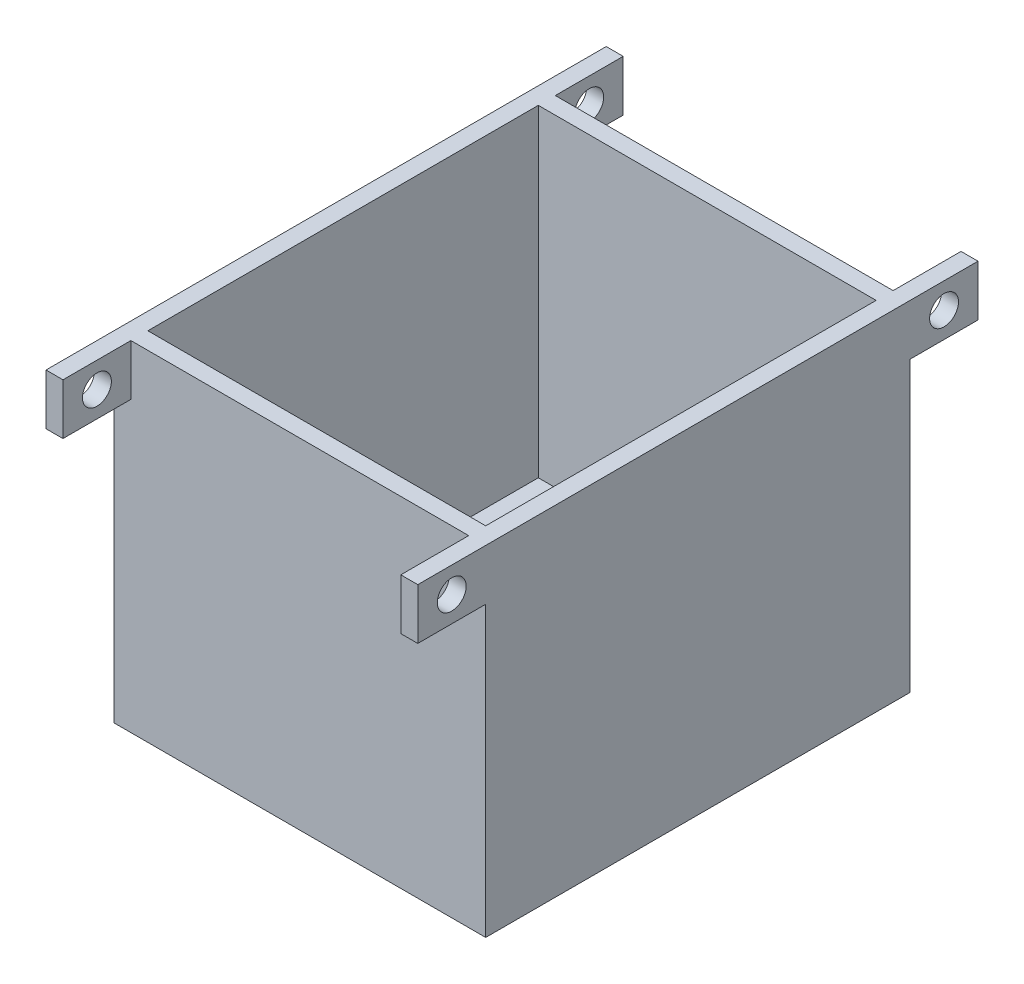
ISO-10303-21;
HEADER;
FILE_DESCRIPTION(('STEP AP214'),'2;1');
FILE_NAME('part.step','',(''),(''),'','','');
FILE_SCHEMA(('AUTOMOTIVE_DESIGN { 1 0 10303 214 1 1 1 1 }'));
ENDSEC;
DATA;
#1=APPLICATION_CONTEXT('core data for automotive mechanical design processes');
#2=APPLICATION_PROTOCOL_DEFINITION('international standard','automotive_design',2000,#1);
#3=PRODUCT_CONTEXT('',#1,'mechanical');
#4=PRODUCT('Part','Part','',(#3));
#5=PRODUCT_RELATED_PRODUCT_CATEGORY('part','',(#4));
#6=PRODUCT_DEFINITION_FORMATION('','',#4);
#7=PRODUCT_DEFINITION_CONTEXT('part definition',#1,'design');
#8=PRODUCT_DEFINITION('design','',#6,#7);
#9=PRODUCT_DEFINITION_SHAPE('','',#8);
#10=(LENGTH_UNIT() NAMED_UNIT(*) SI_UNIT(.MILLI.,.METRE.));
#11=(NAMED_UNIT(*) PLANE_ANGLE_UNIT() SI_UNIT($,.RADIAN.));
#12=(NAMED_UNIT(*) SI_UNIT($,.STERADIAN.) SOLID_ANGLE_UNIT());
#13=UNCERTAINTY_MEASURE_WITH_UNIT(LENGTH_MEASURE(1.E-05),#10,'distance_accuracy_value','');
#14=(GEOMETRIC_REPRESENTATION_CONTEXT(3) GLOBAL_UNCERTAINTY_ASSIGNED_CONTEXT((#13)) GLOBAL_UNIT_ASSIGNED_CONTEXT((#10,
#11,#12)) REPRESENTATION_CONTEXT('',''));
#15=CARTESIAN_POINT('',(0.,0.,0.));
#16=DIRECTION('',(0.,0.,1.));
#17=DIRECTION('',(1.,0.,0.));
#18=AXIS2_PLACEMENT_3D('',#15,#16,#17);
#19=CARTESIAN_POINT('',(-27.813,-50.8,31.75));
#20=DIRECTION('',(0.,0.,1.));
#21=DIRECTION('',(1.,0.,0.));
#22=AXIS2_PLACEMENT_3D('',#19,#20,#21);
#23=PLANE('',#22);
#24=DIRECTION('',(1.,0.,0.));
#25=VECTOR('',#24,1.);
#26=CARTESIAN_POINT('',(-27.813,0.,31.75));
#27=LINE('',#26,#25);
#28=CARTESIAN_POINT('',(-25.273,0.,31.75));
#29=VERTEX_POINT('',#28);
#30=CARTESIAN_POINT('',(25.273,0.,31.75));
#31=VERTEX_POINT('',#30);
#32=EDGE_CURVE('E203',#29,#31,#27,.T.);
#33=ORIENTED_EDGE('',*,*,#32,.F.);
#34=DIRECTION('',(0.,1.,0.));
#35=VECTOR('',#34,1.);
#36=CARTESIAN_POINT('',(-25.273,-7.62,31.75));
#37=LINE('',#36,#35);
#38=CARTESIAN_POINT('',(-25.273,-7.62,31.75));
#39=VERTEX_POINT('',#38);
#40=EDGE_CURVE('E50',#39,#29,#37,.T.);
#41=ORIENTED_EDGE('',*,*,#40,.F.);
#42=DIRECTION('',(-1.,0.,0.));
#43=VECTOR('',#42,1.);
#44=CARTESIAN_POINT('',(-25.273,-7.62,31.75));
#45=LINE('',#44,#43);
#46=CARTESIAN_POINT('',(-27.813,-7.62,31.75));
#47=VERTEX_POINT('',#46);
#48=EDGE_CURVE('E314',#39,#47,#45,.T.);
#49=ORIENTED_EDGE('',*,*,#48,.T.);
#50=DIRECTION('',(0.,1.,0.));
#51=VECTOR('',#50,1.);
#52=CARTESIAN_POINT('',(-27.813,-50.8,31.75));
#53=LINE('',#52,#51);
#54=CARTESIAN_POINT('',(-27.813,-50.8,31.75));
#55=VERTEX_POINT('',#54);
#56=EDGE_CURVE('E42',#55,#47,#53,.T.);
#57=ORIENTED_EDGE('',*,*,#56,.F.);
#58=DIRECTION('',(1.,0.,0.));
#59=VECTOR('',#58,1.);
#60=CARTESIAN_POINT('',(-27.813,-50.8,31.75));
#61=LINE('',#60,#59);
#62=CARTESIAN_POINT('',(27.813,-50.8,31.75));
#63=VERTEX_POINT('',#62);
#64=EDGE_CURVE('E215',#55,#63,#61,.T.);
#65=ORIENTED_EDGE('',*,*,#64,.T.);
#66=DIRECTION('',(0.,1.,0.));
#67=VECTOR('',#66,1.);
#68=CARTESIAN_POINT('',(27.813,-50.8,31.75));
#69=LINE('',#68,#67);
#70=CARTESIAN_POINT('',(27.813,-7.62,31.75));
#71=VERTEX_POINT('',#70);
#72=EDGE_CURVE('E11',#63,#71,#69,.T.);
#73=ORIENTED_EDGE('',*,*,#72,.T.);
#74=DIRECTION('',(1.,0.,0.));
#75=VECTOR('',#74,1.);
#76=CARTESIAN_POINT('',(25.273,-7.62,31.75));
#77=LINE('',#76,#75);
#78=CARTESIAN_POINT('',(25.273,-7.62,31.75));
#79=VERTEX_POINT('',#78);
#80=EDGE_CURVE('E249',#79,#71,#77,.T.);
#81=ORIENTED_EDGE('',*,*,#80,.F.);
#82=DIRECTION('',(0.,1.,0.));
#83=VECTOR('',#82,1.);
#84=CARTESIAN_POINT('',(25.273,-7.62,31.75));
#85=LINE('',#84,#83);
#86=EDGE_CURVE('E270',#79,#31,#85,.T.);
#87=ORIENTED_EDGE('',*,*,#86,.T.);
#88=EDGE_LOOP('',(#33,#41,#49,#57,#65,#73,#81,#87));
#89=FACE_BOUND('',#88,.T.);
#90=ADVANCED_FACE('F33',(#89),#23,.T.);
#91=CARTESIAN_POINT('',(27.813,-50.8,-31.75));
#92=DIRECTION('',(1.,0.,0.));
#93=DIRECTION('',(0.,0.,-1.));
#94=AXIS2_PLACEMENT_3D('',#91,#92,#93);
#95=PLANE('',#94);
#96=DIRECTION('',(0.,0.,-1.));
#97=VECTOR('',#96,1.);
#98=CARTESIAN_POINT('',(27.813,0.,-31.75));
#99=LINE('',#98,#97);
#100=CARTESIAN_POINT('',(27.813,0.,41.91));
#101=VERTEX_POINT('',#100);
#102=CARTESIAN_POINT('',(27.813,0.,-41.91));
#103=VERTEX_POINT('',#102);
#104=EDGE_CURVE('E201',#101,#103,#99,.T.);
#105=ORIENTED_EDGE('',*,*,#104,.F.);
#106=DIRECTION('',(0.,-1.,0.));
#107=VECTOR('',#106,1.);
#108=CARTESIAN_POINT('',(27.813,0.,41.91));
#109=LINE('',#108,#107);
#110=CARTESIAN_POINT('',(27.813,-7.62,41.91));
#111=VERTEX_POINT('',#110);
#112=EDGE_CURVE('E271',#101,#111,#109,.T.);
#113=ORIENTED_EDGE('',*,*,#112,.T.);
#114=DIRECTION('',(0.,0.,-1.));
#115=VECTOR('',#114,1.);
#116=CARTESIAN_POINT('',(27.813,-7.62,41.91));
#117=LINE('',#116,#115);
#118=EDGE_CURVE('E267',#111,#71,#117,.T.);
#119=ORIENTED_EDGE('',*,*,#118,.T.);
#120=ORIENTED_EDGE('',*,*,#72,.F.);
#121=DIRECTION('',(0.,0.,-1.));
#122=VECTOR('',#121,1.);
#123=CARTESIAN_POINT('',(27.813,-50.8,-31.75));
#124=LINE('',#123,#122);
#125=CARTESIAN_POINT('',(27.813,-50.8,-31.75));
#126=VERTEX_POINT('',#125);
#127=EDGE_CURVE('E209',#63,#126,#124,.T.);
#128=ORIENTED_EDGE('',*,*,#127,.T.);
#129=DIRECTION('',(0.,1.,0.));
#130=VECTOR('',#129,1.);
#131=CARTESIAN_POINT('',(27.813,-50.8,-31.75));
#132=LINE('',#131,#130);
#133=CARTESIAN_POINT('',(27.813,-7.62,-31.75));
#134=VERTEX_POINT('',#133);
#135=EDGE_CURVE('E37',#126,#134,#132,.T.);
#136=ORIENTED_EDGE('',*,*,#135,.T.);
#137=DIRECTION('',(0.,0.,1.));
#138=VECTOR('',#137,1.);
#139=CARTESIAN_POINT('',(27.813,-7.62,-41.91));
#140=LINE('',#139,#138);
#141=CARTESIAN_POINT('',(27.813,-7.62,-41.91));
#142=VERTEX_POINT('',#141);
#143=EDGE_CURVE('E58',#142,#134,#140,.T.);
#144=ORIENTED_EDGE('',*,*,#143,.F.);
#145=DIRECTION('',(0.,-1.,0.));
#146=VECTOR('',#145,1.);
#147=CARTESIAN_POINT('',(27.813,0.,-41.91));
#148=LINE('',#147,#146);
#149=EDGE_CURVE('E297',#103,#142,#148,.T.);
#150=ORIENTED_EDGE('',*,*,#149,.F.);
#151=EDGE_LOOP('',(#105,#113,#119,#120,#128,#136,#144,#150));
#152=FACE_BOUND('',#151,.T.);
#153=CARTESIAN_POINT('',(27.813,-3.81,36.83));
#154=DIRECTION('',(1.,0.,0.));
#155=DIRECTION('',(0.,0.,-1.));
#156=AXIS2_PLACEMENT_3D('',#153,#154,#155);
#157=CIRCLE('',#156,2.159);
#158=CARTESIAN_POINT('',(27.813,-3.81,34.671));
#159=VERTEX_POINT('',#158);
#160=EDGE_CURVE('E285',#159,#159,#157,.T.);
#161=ORIENTED_EDGE('',*,*,#160,.F.);
#162=EDGE_LOOP('',(#161));
#163=FACE_BOUND('',#162,.T.);
#164=CARTESIAN_POINT('',(27.813,-3.81,-36.83));
#165=DIRECTION('',(-1.,0.,0.));
#166=DIRECTION('',(0.,0.,1.));
#167=AXIS2_PLACEMENT_3D('',#164,#165,#166);
#168=CIRCLE('',#167,2.159);
#169=CARTESIAN_POINT('',(27.813,-3.81,-34.671));
#170=VERTEX_POINT('',#169);
#171=EDGE_CURVE('E308',#170,#170,#168,.T.);
#172=ORIENTED_EDGE('',*,*,#171,.T.);
#173=EDGE_LOOP('',(#172));
#174=FACE_BOUND('',#173,.T.);
#175=ADVANCED_FACE('F35',(#152,#163,#174),#95,.T.);
#176=CARTESIAN_POINT('',(-27.813,-50.8,-31.75));
#177=DIRECTION('',(-1.,0.,0.));
#178=DIRECTION('',(0.,0.,1.));
#179=AXIS2_PLACEMENT_3D('',#176,#177,#178);
#180=PLANE('',#179);
#181=DIRECTION('',(0.,0.,1.));
#182=VECTOR('',#181,1.);
#183=CARTESIAN_POINT('',(-27.813,0.,-31.75));
#184=LINE('',#183,#182);
#185=CARTESIAN_POINT('',(-27.813,0.,-41.91));
#186=VERTEX_POINT('',#185);
#187=CARTESIAN_POINT('',(-27.813,0.,41.91));
#188=VERTEX_POINT('',#187);
#189=EDGE_CURVE('E200',#186,#188,#184,.T.);
#190=ORIENTED_EDGE('',*,*,#189,.F.);
#191=DIRECTION('',(0.,-1.,0.));
#192=VECTOR('',#191,1.);
#193=CARTESIAN_POINT('',(-27.813,0.,-41.91));
#194=LINE('',#193,#192);
#195=CARTESIAN_POINT('',(-27.813,-7.62,-41.91));
#196=VERTEX_POINT('',#195);
#197=EDGE_CURVE('E347',#186,#196,#194,.T.);
#198=ORIENTED_EDGE('',*,*,#197,.T.);
#199=DIRECTION('',(0.,0.,1.));
#200=VECTOR('',#199,1.);
#201=CARTESIAN_POINT('',(-27.813,-7.62,-41.91));
#202=LINE('',#201,#200);
#203=CARTESIAN_POINT('',(-27.813,-7.62,-31.75));
#204=VERTEX_POINT('',#203);
#205=EDGE_CURVE('E194',#196,#204,#202,.T.);
#206=ORIENTED_EDGE('',*,*,#205,.T.);
#207=DIRECTION('',(0.,1.,0.));
#208=VECTOR('',#207,1.);
#209=CARTESIAN_POINT('',(-27.813,-50.8,-31.75));
#210=LINE('',#209,#208);
#211=CARTESIAN_POINT('',(-27.813,-50.8,-31.75));
#212=VERTEX_POINT('',#211);
#213=EDGE_CURVE('E212',#212,#204,#210,.T.);
#214=ORIENTED_EDGE('',*,*,#213,.F.);
#215=DIRECTION('',(0.,0.,1.));
#216=VECTOR('',#215,1.);
#217=CARTESIAN_POINT('',(-27.813,-50.8,-31.75));
#218=LINE('',#217,#216);
#219=EDGE_CURVE('E219',#212,#55,#218,.T.);
#220=ORIENTED_EDGE('',*,*,#219,.T.);
#221=ORIENTED_EDGE('',*,*,#56,.T.);
#222=DIRECTION('',(0.,0.,-1.));
#223=VECTOR('',#222,1.);
#224=CARTESIAN_POINT('',(-27.813,-7.62,41.91));
#225=LINE('',#224,#223);
#226=CARTESIAN_POINT('',(-27.813,-7.62,41.91));
#227=VERTEX_POINT('',#226);
#228=EDGE_CURVE('E325',#227,#47,#225,.T.);
#229=ORIENTED_EDGE('',*,*,#228,.F.);
#230=DIRECTION('',(0.,-1.,0.));
#231=VECTOR('',#230,1.);
#232=CARTESIAN_POINT('',(-27.813,0.,41.91));
#233=LINE('',#232,#231);
#234=EDGE_CURVE('E323',#188,#227,#233,.T.);
#235=ORIENTED_EDGE('',*,*,#234,.F.);
#236=EDGE_LOOP('',(#190,#198,#206,#214,#220,#221,#229,#235));
#237=FACE_BOUND('',#236,.T.);
#238=CARTESIAN_POINT('',(-27.813,-3.81,36.83));
#239=DIRECTION('',(1.,0.,0.));
#240=DIRECTION('',(0.,0.,-1.));
#241=AXIS2_PLACEMENT_3D('',#238,#239,#240);
#242=CIRCLE('',#241,2.159);
#243=CARTESIAN_POINT('',(-27.813,-3.81,34.671));
#244=VERTEX_POINT('',#243);
#245=EDGE_CURVE('E334',#244,#244,#242,.T.);
#246=ORIENTED_EDGE('',*,*,#245,.T.);
#247=EDGE_LOOP('',(#246));
#248=FACE_BOUND('',#247,.T.);
#249=CARTESIAN_POINT('',(-27.813,-3.81,-36.83));
#250=DIRECTION('',(-1.,0.,0.));
#251=DIRECTION('',(0.,0.,1.));
#252=AXIS2_PLACEMENT_3D('',#249,#250,#251);
#253=CIRCLE('',#252,2.159);
#254=CARTESIAN_POINT('',(-27.813,-3.81,-34.671));
#255=VERTEX_POINT('',#254);
#256=EDGE_CURVE('E353',#255,#255,#253,.T.);
#257=ORIENTED_EDGE('',*,*,#256,.F.);
#258=EDGE_LOOP('',(#257));
#259=FACE_BOUND('',#258,.T.);
#260=ADVANCED_FACE('F366',(#237,#248,#259),#180,.T.);
#261=CARTESIAN_POINT('',(-27.813,-50.8,-31.75));
#262=DIRECTION('',(0.,0.,-1.));
#263=DIRECTION('',(-1.,0.,0.));
#264=AXIS2_PLACEMENT_3D('',#261,#262,#263);
#265=PLANE('',#264);
#266=DIRECTION('',(-1.,0.,0.));
#267=VECTOR('',#266,1.);
#268=CARTESIAN_POINT('',(-25.273,-7.62,-31.75));
#269=LINE('',#268,#267);
#270=CARTESIAN_POINT('',(-25.273,-7.62,-31.75));
#271=VERTEX_POINT('',#270);
#272=EDGE_CURVE('E193',#271,#204,#269,.T.);
#273=ORIENTED_EDGE('',*,*,#272,.F.);
#274=DIRECTION('',(0.,1.,0.));
#275=VECTOR('',#274,1.);
#276=CARTESIAN_POINT('',(-25.273,-7.62,-31.75));
#277=LINE('',#276,#275);
#278=CARTESIAN_POINT('',(-25.273,0.,-31.75));
#279=VERTEX_POINT('',#278);
#280=EDGE_CURVE('E178',#271,#279,#277,.T.);
#281=ORIENTED_EDGE('',*,*,#280,.T.);
#282=DIRECTION('',(-1.,0.,0.));
#283=VECTOR('',#282,1.);
#284=CARTESIAN_POINT('',(-27.813,0.,-31.75));
#285=LINE('',#284,#283);
#286=CARTESIAN_POINT('',(25.273,0.,-31.75));
#287=VERTEX_POINT('',#286);
#288=EDGE_CURVE('E191',#287,#279,#285,.T.);
#289=ORIENTED_EDGE('',*,*,#288,.F.);
#290=DIRECTION('',(0.,1.,0.));
#291=VECTOR('',#290,1.);
#292=CARTESIAN_POINT('',(25.273,-7.62,-31.75));
#293=LINE('',#292,#291);
#294=CARTESIAN_POINT('',(25.273,-7.62,-31.75));
#295=VERTEX_POINT('',#294);
#296=EDGE_CURVE('E299',#295,#287,#293,.T.);
#297=ORIENTED_EDGE('',*,*,#296,.F.);
#298=DIRECTION('',(1.,0.,0.));
#299=VECTOR('',#298,1.);
#300=CARTESIAN_POINT('',(25.273,-7.62,-31.75));
#301=LINE('',#300,#299);
#302=EDGE_CURVE('E291',#295,#134,#301,.T.);
#303=ORIENTED_EDGE('',*,*,#302,.T.);
#304=ORIENTED_EDGE('',*,*,#135,.F.);
#305=DIRECTION('',(-1.,0.,0.));
#306=VECTOR('',#305,1.);
#307=CARTESIAN_POINT('',(-27.813,-50.8,-31.75));
#308=LINE('',#307,#306);
#309=EDGE_CURVE('E223',#126,#212,#308,.T.);
#310=ORIENTED_EDGE('',*,*,#309,.T.);
#311=ORIENTED_EDGE('',*,*,#213,.T.);
#312=EDGE_LOOP('',(#273,#281,#289,#297,#303,#304,#310,#311));
#313=FACE_BOUND('',#312,.T.);
#314=ADVANCED_FACE('F189',(#313),#265,.T.);
#315=CARTESIAN_POINT('',(0.,-50.8,0.));
#316=DIRECTION('',(0.,1.,0.));
#317=DIRECTION('',(0.,0.,1.));
#318=AXIS2_PLACEMENT_3D('',#315,#316,#317);
#319=PLANE('',#318);
#320=ORIENTED_EDGE('',*,*,#127,.F.);
#321=ORIENTED_EDGE('',*,*,#64,.F.);
#322=ORIENTED_EDGE('',*,*,#219,.F.);
#323=ORIENTED_EDGE('',*,*,#309,.F.);
#324=EDGE_LOOP('',(#320,#321,#322,#323));
#325=FACE_BOUND('',#324,.T.);
#326=ADVANCED_FACE('F374',(#325),#319,.F.);
#327=CARTESIAN_POINT('',(0.,0.,0.));
#328=DIRECTION('',(0.,1.,0.));
#329=DIRECTION('',(0.,0.,1.));
#330=AXIS2_PLACEMENT_3D('',#327,#328,#329);
#331=PLANE('',#330);
#332=DIRECTION('',(0.,0.,1.));
#333=VECTOR('',#332,1.);
#334=CARTESIAN_POINT('',(-25.273,0.,-29.21));
#335=LINE('',#334,#333);
#336=CARTESIAN_POINT('',(-25.273,0.,-29.21));
#337=VERTEX_POINT('',#336);
#338=CARTESIAN_POINT('',(-25.273,0.,29.21));
#339=VERTEX_POINT('',#338);
#340=EDGE_CURVE('E247',#337,#339,#335,.T.);
#341=ORIENTED_EDGE('',*,*,#340,.F.);
#342=DIRECTION('',(-1.,0.,0.));
#343=VECTOR('',#342,1.);
#344=CARTESIAN_POINT('',(25.273,0.,-29.21));
#345=LINE('',#344,#343);
#346=CARTESIAN_POINT('',(25.273,0.,-29.21));
#347=VERTEX_POINT('',#346);
#348=EDGE_CURVE('E237',#347,#337,#345,.T.);
#349=ORIENTED_EDGE('',*,*,#348,.F.);
#350=DIRECTION('',(0.,0.,-1.));
#351=VECTOR('',#350,1.);
#352=CARTESIAN_POINT('',(25.273,0.,-29.21));
#353=LINE('',#352,#351);
#354=CARTESIAN_POINT('',(25.273,0.,29.21));
#355=VERTEX_POINT('',#354);
#356=EDGE_CURVE('E241',#355,#347,#353,.T.);
#357=ORIENTED_EDGE('',*,*,#356,.F.);
#358=DIRECTION('',(1.,0.,0.));
#359=VECTOR('',#358,1.);
#360=CARTESIAN_POINT('',(25.273,0.,29.21));
#361=LINE('',#360,#359);
#362=EDGE_CURVE('E244',#339,#355,#361,.T.);
#363=ORIENTED_EDGE('',*,*,#362,.F.);
#364=EDGE_LOOP('',(#341,#349,#357,#363));
#365=FACE_BOUND('',#364,.T.);
#366=ORIENTED_EDGE('',*,*,#104,.T.);
#367=DIRECTION('',(1.,0.,0.));
#368=VECTOR('',#367,1.);
#369=CARTESIAN_POINT('',(25.273,0.,-41.91));
#370=LINE('',#369,#368);
#371=CARTESIAN_POINT('',(25.273,0.,-41.91));
#372=VERTEX_POINT('',#371);
#373=EDGE_CURVE('E288',#372,#103,#370,.T.);
#374=ORIENTED_EDGE('',*,*,#373,.F.);
#375=DIRECTION('',(0.,0.,-1.));
#376=VECTOR('',#375,1.);
#377=CARTESIAN_POINT('',(25.273,0.,-31.75));
#378=LINE('',#377,#376);
#379=EDGE_CURVE('E198',#287,#372,#378,.T.);
#380=ORIENTED_EDGE('',*,*,#379,.F.);
#381=ORIENTED_EDGE('',*,*,#288,.T.);
#382=DIRECTION('',(0.,0.,-1.));
#383=VECTOR('',#382,1.);
#384=CARTESIAN_POINT('',(-25.273,0.,-31.75));
#385=LINE('',#384,#383);
#386=CARTESIAN_POINT('',(-25.273,0.,-41.91));
#387=VERTEX_POINT('',#386);
#388=EDGE_CURVE('E174',#279,#387,#385,.T.);
#389=ORIENTED_EDGE('',*,*,#388,.T.);
#390=DIRECTION('',(-1.,0.,0.));
#391=VECTOR('',#390,1.);
#392=CARTESIAN_POINT('',(-25.273,0.,-41.91));
#393=LINE('',#392,#391);
#394=EDGE_CURVE('E339',#387,#186,#393,.T.);
#395=ORIENTED_EDGE('',*,*,#394,.T.);
#396=ORIENTED_EDGE('',*,*,#189,.T.);
#397=DIRECTION('',(-1.,0.,0.));
#398=VECTOR('',#397,1.);
#399=CARTESIAN_POINT('',(-25.273,0.,41.91));
#400=LINE('',#399,#398);
#401=CARTESIAN_POINT('',(-25.273,0.,41.91));
#402=VERTEX_POINT('',#401);
#403=EDGE_CURVE('E311',#402,#188,#400,.T.);
#404=ORIENTED_EDGE('',*,*,#403,.F.);
#405=DIRECTION('',(0.,0.,1.));
#406=VECTOR('',#405,1.);
#407=CARTESIAN_POINT('',(-25.273,0.,31.75));
#408=LINE('',#407,#406);
#409=EDGE_CURVE('E318',#29,#402,#408,.T.);
#410=ORIENTED_EDGE('',*,*,#409,.F.);
#411=ORIENTED_EDGE('',*,*,#32,.T.);
#412=DIRECTION('',(0.,0.,1.));
#413=VECTOR('',#412,1.);
#414=CARTESIAN_POINT('',(25.273,0.,31.75));
#415=LINE('',#414,#413);
#416=CARTESIAN_POINT('',(25.273,0.,41.91));
#417=VERTEX_POINT('',#416);
#418=EDGE_CURVE('E280',#31,#417,#415,.T.);
#419=ORIENTED_EDGE('',*,*,#418,.T.);
#420=DIRECTION('',(1.,0.,0.));
#421=VECTOR('',#420,1.);
#422=CARTESIAN_POINT('',(25.273,0.,41.91));
#423=LINE('',#422,#421);
#424=EDGE_CURVE('E260',#417,#101,#423,.T.);
#425=ORIENTED_EDGE('',*,*,#424,.T.);
#426=EDGE_LOOP('',(#366,#374,#380,#381,#389,#395,#396,#404,#410,#411,#419,#425));
#427=FACE_BOUND('',#426,.T.);
#428=ADVANCED_FACE('F196',(#365,#427),#331,.T.);
#429=CARTESIAN_POINT('',(-25.273,-48.26,-29.21));
#430=DIRECTION('',(-1.,0.,0.));
#431=DIRECTION('',(0.,0.,1.));
#432=AXIS2_PLACEMENT_3D('',#429,#430,#431);
#433=PLANE('',#432);
#434=ORIENTED_EDGE('',*,*,#340,.T.);
#435=DIRECTION('',(0.,1.,0.));
#436=VECTOR('',#435,1.);
#437=CARTESIAN_POINT('',(-25.273,-48.26,29.21));
#438=LINE('',#437,#436);
#439=CARTESIAN_POINT('',(-25.273,-48.26,29.21));
#440=VERTEX_POINT('',#439);
#441=EDGE_CURVE('E228',#440,#339,#438,.T.);
#442=ORIENTED_EDGE('',*,*,#441,.F.);
#443=DIRECTION('',(0.,0.,1.));
#444=VECTOR('',#443,1.);
#445=CARTESIAN_POINT('',(-25.273,-48.26,-29.21));
#446=LINE('',#445,#444);
#447=CARTESIAN_POINT('',(-25.273,-48.26,-29.21));
#448=VERTEX_POINT('',#447);
#449=EDGE_CURVE('E240',#448,#440,#446,.T.);
#450=ORIENTED_EDGE('',*,*,#449,.F.);
#451=DIRECTION('',(0.,1.,0.));
#452=VECTOR('',#451,1.);
#453=CARTESIAN_POINT('',(-25.273,-48.26,-29.21));
#454=LINE('',#453,#452);
#455=EDGE_CURVE('E205',#448,#337,#454,.T.);
#456=ORIENTED_EDGE('',*,*,#455,.T.);
#457=EDGE_LOOP('',(#434,#442,#450,#456));
#458=FACE_BOUND('',#457,.T.);
#459=ADVANCED_FACE('F384',(#458),#433,.F.);
#460=CARTESIAN_POINT('',(25.273,-48.26,-29.21));
#461=DIRECTION('',(0.,0.,-1.));
#462=DIRECTION('',(-1.,0.,0.));
#463=AXIS2_PLACEMENT_3D('',#460,#461,#462);
#464=PLANE('',#463);
#465=ORIENTED_EDGE('',*,*,#348,.T.);
#466=ORIENTED_EDGE('',*,*,#455,.F.);
#467=DIRECTION('',(-1.,0.,0.));
#468=VECTOR('',#467,1.);
#469=CARTESIAN_POINT('',(25.273,-48.26,-29.21));
#470=LINE('',#469,#468);
#471=CARTESIAN_POINT('',(25.273,-48.26,-29.21));
#472=VERTEX_POINT('',#471);
#473=EDGE_CURVE('E232',#472,#448,#470,.T.);
#474=ORIENTED_EDGE('',*,*,#473,.F.);
#475=DIRECTION('',(0.,1.,0.));
#476=VECTOR('',#475,1.);
#477=CARTESIAN_POINT('',(25.273,-48.26,-29.21));
#478=LINE('',#477,#476);
#479=EDGE_CURVE('E234',#472,#347,#478,.T.);
#480=ORIENTED_EDGE('',*,*,#479,.T.);
#481=EDGE_LOOP('',(#465,#466,#474,#480));
#482=FACE_BOUND('',#481,.T.);
#483=ADVANCED_FACE('F391',(#482),#464,.F.);
#484=CARTESIAN_POINT('',(25.273,-48.26,-29.21));
#485=DIRECTION('',(1.,0.,0.));
#486=DIRECTION('',(0.,0.,-1.));
#487=AXIS2_PLACEMENT_3D('',#484,#485,#486);
#488=PLANE('',#487);
#489=ORIENTED_EDGE('',*,*,#356,.T.);
#490=ORIENTED_EDGE('',*,*,#479,.F.);
#491=DIRECTION('',(0.,0.,-1.));
#492=VECTOR('',#491,1.);
#493=CARTESIAN_POINT('',(25.273,-48.26,-29.21));
#494=LINE('',#493,#492);
#495=CARTESIAN_POINT('',(25.273,-48.26,29.21));
#496=VERTEX_POINT('',#495);
#497=EDGE_CURVE('E252',#496,#472,#494,.T.);
#498=ORIENTED_EDGE('',*,*,#497,.F.);
#499=DIRECTION('',(0.,1.,0.));
#500=VECTOR('',#499,1.);
#501=CARTESIAN_POINT('',(25.273,-48.26,29.21));
#502=LINE('',#501,#500);
#503=EDGE_CURVE('E231',#496,#355,#502,.T.);
#504=ORIENTED_EDGE('',*,*,#503,.T.);
#505=EDGE_LOOP('',(#489,#490,#498,#504));
#506=FACE_BOUND('',#505,.T.);
#507=ADVANCED_FACE('F397',(#506),#488,.F.);
#508=CARTESIAN_POINT('',(25.273,-48.26,29.21));
#509=DIRECTION('',(0.,0.,1.));
#510=DIRECTION('',(1.,0.,0.));
#511=AXIS2_PLACEMENT_3D('',#508,#509,#510);
#512=PLANE('',#511);
#513=ORIENTED_EDGE('',*,*,#362,.T.);
#514=ORIENTED_EDGE('',*,*,#503,.F.);
#515=DIRECTION('',(1.,0.,0.));
#516=VECTOR('',#515,1.);
#517=CARTESIAN_POINT('',(25.273,-48.26,29.21));
#518=LINE('',#517,#516);
#519=EDGE_CURVE('E255',#440,#496,#518,.T.);
#520=ORIENTED_EDGE('',*,*,#519,.F.);
#521=ORIENTED_EDGE('',*,*,#441,.T.);
#522=EDGE_LOOP('',(#513,#514,#520,#521));
#523=FACE_BOUND('',#522,.T.);
#524=ADVANCED_FACE('F393',(#523),#512,.F.);
#525=CARTESIAN_POINT('',(0.,-48.26,0.));
#526=DIRECTION('',(0.,-1.,0.));
#527=DIRECTION('',(0.,0.,-1.));
#528=AXIS2_PLACEMENT_3D('',#525,#526,#527);
#529=PLANE('',#528);
#530=ORIENTED_EDGE('',*,*,#449,.T.);
#531=ORIENTED_EDGE('',*,*,#519,.T.);
#532=ORIENTED_EDGE('',*,*,#497,.T.);
#533=ORIENTED_EDGE('',*,*,#473,.T.);
#534=EDGE_LOOP('',(#530,#531,#532,#533));
#535=FACE_BOUND('',#534,.T.);
#536=ADVANCED_FACE('F396',(#535),#529,.F.);
#537=CARTESIAN_POINT('',(25.273,-7.62,41.91));
#538=DIRECTION('',(0.,-1.,0.));
#539=DIRECTION('',(0.,0.,-1.));
#540=AXIS2_PLACEMENT_3D('',#537,#538,#539);
#541=PLANE('',#540);
#542=ORIENTED_EDGE('',*,*,#118,.F.);
#543=DIRECTION('',(1.,0.,0.));
#544=VECTOR('',#543,1.);
#545=CARTESIAN_POINT('',(25.273,-7.62,41.91));
#546=LINE('',#545,#544);
#547=CARTESIAN_POINT('',(25.273,-7.62,41.91));
#548=VERTEX_POINT('',#547);
#549=EDGE_CURVE('E263',#548,#111,#546,.T.);
#550=ORIENTED_EDGE('',*,*,#549,.F.);
#551=DIRECTION('',(0.,0.,-1.));
#552=VECTOR('',#551,1.);
#553=CARTESIAN_POINT('',(25.273,-7.62,41.91));
#554=LINE('',#553,#552);
#555=EDGE_CURVE('E264',#548,#79,#554,.T.);
#556=ORIENTED_EDGE('',*,*,#555,.T.);
#557=ORIENTED_EDGE('',*,*,#80,.T.);
#558=EDGE_LOOP('',(#542,#550,#556,#557));
#559=FACE_BOUND('',#558,.T.);
#560=ADVANCED_FACE('F407',(#559),#541,.T.);
#561=CARTESIAN_POINT('',(25.273,0.,41.91));
#562=DIRECTION('',(0.,0.,1.));
#563=DIRECTION('',(1.,0.,0.));
#564=AXIS2_PLACEMENT_3D('',#561,#562,#563);
#565=PLANE('',#564);
#566=ORIENTED_EDGE('',*,*,#112,.F.);
#567=ORIENTED_EDGE('',*,*,#424,.F.);
#568=DIRECTION('',(0.,-1.,0.));
#569=VECTOR('',#568,1.);
#570=CARTESIAN_POINT('',(25.273,0.,41.91));
#571=LINE('',#570,#569);
#572=EDGE_CURVE('E277',#417,#548,#571,.T.);
#573=ORIENTED_EDGE('',*,*,#572,.T.);
#574=ORIENTED_EDGE('',*,*,#549,.T.);
#575=EDGE_LOOP('',(#566,#567,#573,#574));
#576=FACE_BOUND('',#575,.T.);
#577=ADVANCED_FACE('F409',(#576),#565,.T.);
#578=CARTESIAN_POINT('',(25.273,0.,0.));
#579=DIRECTION('',(1.,0.,0.));
#580=DIRECTION('',(0.,0.,-1.));
#581=AXIS2_PLACEMENT_3D('',#578,#579,#580);
#582=PLANE('',#581);
#583=CARTESIAN_POINT('',(25.273,-3.81,36.83));
#584=DIRECTION('',(1.,0.,0.));
#585=DIRECTION('',(0.,0.,-1.));
#586=AXIS2_PLACEMENT_3D('',#583,#584,#585);
#587=CIRCLE('',#586,2.159);
#588=CARTESIAN_POINT('',(25.273,-3.81,34.671));
#589=VERTEX_POINT('',#588);
#590=EDGE_CURVE('E274',#589,#589,#587,.T.);
#591=ORIENTED_EDGE('',*,*,#590,.T.);
#592=EDGE_LOOP('',(#591));
#593=FACE_BOUND('',#592,.T.);
#594=ORIENTED_EDGE('',*,*,#86,.F.);
#595=ORIENTED_EDGE('',*,*,#555,.F.);
#596=ORIENTED_EDGE('',*,*,#572,.F.);
#597=ORIENTED_EDGE('',*,*,#418,.F.);
#598=EDGE_LOOP('',(#594,#595,#596,#597));
#599=FACE_BOUND('',#598,.T.);
#600=ADVANCED_FACE('F412',(#593,#599),#582,.F.);
#601=CARTESIAN_POINT('',(25.273,-3.81,36.83));
#602=DIRECTION('',(1.,0.,0.));
#603=DIRECTION('',(0.,0.,-1.));
#604=AXIS2_PLACEMENT_3D('',#601,#602,#603);
#605=CYLINDRICAL_SURFACE('',#604,2.159);
#606=ORIENTED_EDGE('',*,*,#590,.F.);
#607=EDGE_LOOP('',(#606));
#608=FACE_BOUND('',#607,.T.);
#609=ORIENTED_EDGE('',*,*,#160,.T.);
#610=EDGE_LOOP('',(#609));
#611=FACE_BOUND('',#610,.T.);
#612=ADVANCED_FACE('F419',(#608,#611),#605,.F.);
#613=CARTESIAN_POINT('',(25.273,0.,0.));
#614=DIRECTION('',(1.,0.,0.));
#615=DIRECTION('',(0.,0.,1.));
#616=AXIS2_PLACEMENT_3D('',#613,#614,#615);
#617=PLANE('',#616);
#618=ORIENTED_EDGE('',*,*,#296,.T.);
#619=ORIENTED_EDGE('',*,*,#379,.T.);
#620=DIRECTION('',(0.,-1.,0.));
#621=VECTOR('',#620,1.);
#622=CARTESIAN_POINT('',(25.273,0.,-41.91));
#623=LINE('',#622,#621);
#624=CARTESIAN_POINT('',(25.273,-7.62,-41.91));
#625=VERTEX_POINT('',#624);
#626=EDGE_CURVE('E303',#372,#625,#623,.T.);
#627=ORIENTED_EDGE('',*,*,#626,.T.);
#628=DIRECTION('',(0.,0.,1.));
#629=VECTOR('',#628,1.);
#630=CARTESIAN_POINT('',(25.273,-7.62,-41.91));
#631=LINE('',#630,#629);
#632=EDGE_CURVE('E305',#625,#295,#631,.T.);
#633=ORIENTED_EDGE('',*,*,#632,.T.);
#634=EDGE_LOOP('',(#618,#619,#627,#633));
#635=FACE_BOUND('',#634,.T.);
#636=CARTESIAN_POINT('',(25.273,-3.81,-36.83));
#637=DIRECTION('',(-1.,0.,0.));
#638=DIRECTION('',(0.,0.,1.));
#639=AXIS2_PLACEMENT_3D('',#636,#637,#638);
#640=CIRCLE('',#639,2.159);
#641=CARTESIAN_POINT('',(25.273,-3.81,-34.671));
#642=VERTEX_POINT('',#641);
#643=EDGE_CURVE('E301',#642,#642,#640,.T.);
#644=ORIENTED_EDGE('',*,*,#643,.F.);
#645=EDGE_LOOP('',(#644));
#646=FACE_BOUND('',#645,.T.);
#647=ADVANCED_FACE('F423',(#635,#646),#617,.F.);
#648=CARTESIAN_POINT('',(25.273,0.,-41.91));
#649=DIRECTION('',(0.,0.,1.));
#650=DIRECTION('',(1.,0.,0.));
#651=AXIS2_PLACEMENT_3D('',#648,#649,#650);
#652=PLANE('',#651);
#653=ORIENTED_EDGE('',*,*,#149,.T.);
#654=DIRECTION('',(1.,0.,0.));
#655=VECTOR('',#654,1.);
#656=CARTESIAN_POINT('',(25.273,-7.62,-41.91));
#657=LINE('',#656,#655);
#658=EDGE_CURVE('E293',#625,#142,#657,.T.);
#659=ORIENTED_EDGE('',*,*,#658,.F.);
#660=ORIENTED_EDGE('',*,*,#626,.F.);
#661=ORIENTED_EDGE('',*,*,#373,.T.);
#662=EDGE_LOOP('',(#653,#659,#660,#661));
#663=FACE_BOUND('',#662,.T.);
#664=ADVANCED_FACE('F429',(#663),#652,.F.);
#665=CARTESIAN_POINT('',(25.273,-7.62,-41.91));
#666=DIRECTION('',(0.,1.,0.));
#667=DIRECTION('',(0.,0.,1.));
#668=AXIS2_PLACEMENT_3D('',#665,#666,#667);
#669=PLANE('',#668);
#670=ORIENTED_EDGE('',*,*,#143,.T.);
#671=ORIENTED_EDGE('',*,*,#302,.F.);
#672=ORIENTED_EDGE('',*,*,#632,.F.);
#673=ORIENTED_EDGE('',*,*,#658,.T.);
#674=EDGE_LOOP('',(#670,#671,#672,#673));
#675=FACE_BOUND('',#674,.T.);
#676=ADVANCED_FACE('F425',(#675),#669,.F.);
#677=CARTESIAN_POINT('',(25.273,-3.81,-36.83));
#678=DIRECTION('',(1.,0.,0.));
#679=DIRECTION('',(0.,0.,-1.));
#680=AXIS2_PLACEMENT_3D('',#677,#678,#679);
#681=CYLINDRICAL_SURFACE('',#680,2.159);
#682=ORIENTED_EDGE('',*,*,#643,.T.);
#683=EDGE_LOOP('',(#682));
#684=FACE_BOUND('',#683,.T.);
#685=ORIENTED_EDGE('',*,*,#171,.F.);
#686=EDGE_LOOP('',(#685));
#687=FACE_BOUND('',#686,.T.);
#688=ADVANCED_FACE('F428',(#684,#687),#681,.F.);
#689=CARTESIAN_POINT('',(-25.273,0.,0.));
#690=DIRECTION('',(-1.,0.,0.));
#691=DIRECTION('',(0.,0.,-1.));
#692=AXIS2_PLACEMENT_3D('',#689,#690,#691);
#693=PLANE('',#692);
#694=ORIENTED_EDGE('',*,*,#40,.T.);
#695=ORIENTED_EDGE('',*,*,#409,.T.);
#696=DIRECTION('',(0.,-1.,0.));
#697=VECTOR('',#696,1.);
#698=CARTESIAN_POINT('',(-25.273,0.,41.91));
#699=LINE('',#698,#697);
#700=CARTESIAN_POINT('',(-25.273,-7.62,41.91));
#701=VERTEX_POINT('',#700);
#702=EDGE_CURVE('E329',#402,#701,#699,.T.);
#703=ORIENTED_EDGE('',*,*,#702,.T.);
#704=DIRECTION('',(0.,0.,-1.));
#705=VECTOR('',#704,1.);
#706=CARTESIAN_POINT('',(-25.273,-7.62,41.91));
#707=LINE('',#706,#705);
#708=EDGE_CURVE('E331',#701,#39,#707,.T.);
#709=ORIENTED_EDGE('',*,*,#708,.T.);
#710=EDGE_LOOP('',(#694,#695,#703,#709));
#711=FACE_BOUND('',#710,.T.);
#712=CARTESIAN_POINT('',(-25.273,-3.81,36.83));
#713=DIRECTION('',(1.,0.,0.));
#714=DIRECTION('',(0.,0.,-1.));
#715=AXIS2_PLACEMENT_3D('',#712,#713,#714);
#716=CIRCLE('',#715,2.159);
#717=CARTESIAN_POINT('',(-25.273,-3.81,34.671));
#718=VERTEX_POINT('',#717);
#719=EDGE_CURVE('E327',#718,#718,#716,.T.);
#720=ORIENTED_EDGE('',*,*,#719,.F.);
#721=EDGE_LOOP('',(#720));
#722=FACE_BOUND('',#721,.T.);
#723=ADVANCED_FACE('F438',(#711,#722),#693,.F.);
#724=CARTESIAN_POINT('',(-25.273,0.,41.91));
#725=DIRECTION('',(0.,0.,-1.));
#726=DIRECTION('',(-1.,0.,0.));
#727=AXIS2_PLACEMENT_3D('',#724,#725,#726);
#728=PLANE('',#727);
#729=ORIENTED_EDGE('',*,*,#234,.T.);
#730=DIRECTION('',(-1.,0.,0.));
#731=VECTOR('',#730,1.);
#732=CARTESIAN_POINT('',(-25.273,-7.62,41.91));
#733=LINE('',#732,#731);
#734=EDGE_CURVE('E317',#701,#227,#733,.T.);
#735=ORIENTED_EDGE('',*,*,#734,.F.);
#736=ORIENTED_EDGE('',*,*,#702,.F.);
#737=ORIENTED_EDGE('',*,*,#403,.T.);
#738=EDGE_LOOP('',(#729,#735,#736,#737));
#739=FACE_BOUND('',#738,.T.);
#740=ADVANCED_FACE('F444',(#739),#728,.F.);
#741=CARTESIAN_POINT('',(-25.273,-7.62,41.91));
#742=DIRECTION('',(0.,1.,0.));
#743=DIRECTION('',(0.,0.,1.));
#744=AXIS2_PLACEMENT_3D('',#741,#742,#743);
#745=PLANE('',#744);
#746=ORIENTED_EDGE('',*,*,#228,.T.);
#747=ORIENTED_EDGE('',*,*,#48,.F.);
#748=ORIENTED_EDGE('',*,*,#708,.F.);
#749=ORIENTED_EDGE('',*,*,#734,.T.);
#750=EDGE_LOOP('',(#746,#747,#748,#749));
#751=FACE_BOUND('',#750,.T.);
#752=ADVANCED_FACE('F440',(#751),#745,.F.);
#753=CARTESIAN_POINT('',(-25.273,-3.81,36.83));
#754=DIRECTION('',(-1.,0.,0.));
#755=DIRECTION('',(0.,0.,1.));
#756=AXIS2_PLACEMENT_3D('',#753,#754,#755);
#757=CYLINDRICAL_SURFACE('',#756,2.159);
#758=ORIENTED_EDGE('',*,*,#719,.T.);
#759=EDGE_LOOP('',(#758));
#760=FACE_BOUND('',#759,.T.);
#761=ORIENTED_EDGE('',*,*,#245,.F.);
#762=EDGE_LOOP('',(#761));
#763=FACE_BOUND('',#762,.T.);
#764=ADVANCED_FACE('F443',(#760,#763),#757,.F.);
#765=CARTESIAN_POINT('',(-25.273,-7.62,-41.91));
#766=DIRECTION('',(0.,-1.,0.));
#767=DIRECTION('',(0.,0.,-1.));
#768=AXIS2_PLACEMENT_3D('',#765,#766,#767);
#769=PLANE('',#768);
#770=ORIENTED_EDGE('',*,*,#205,.F.);
#771=DIRECTION('',(-1.,0.,0.));
#772=VECTOR('',#771,1.);
#773=CARTESIAN_POINT('',(-25.273,-7.62,-41.91));
#774=LINE('',#773,#772);
#775=CARTESIAN_POINT('',(-25.273,-7.62,-41.91));
#776=VERTEX_POINT('',#775);
#777=EDGE_CURVE('E341',#776,#196,#774,.T.);
#778=ORIENTED_EDGE('',*,*,#777,.F.);
#779=DIRECTION('',(0.,0.,1.));
#780=VECTOR('',#779,1.);
#781=CARTESIAN_POINT('',(-25.273,-7.62,-41.91));
#782=LINE('',#781,#780);
#783=EDGE_CURVE('E342',#776,#271,#782,.T.);
#784=ORIENTED_EDGE('',*,*,#783,.T.);
#785=ORIENTED_EDGE('',*,*,#272,.T.);
#786=EDGE_LOOP('',(#770,#778,#784,#785));
#787=FACE_BOUND('',#786,.T.);
#788=ADVANCED_FACE('F453',(#787),#769,.T.);
#789=CARTESIAN_POINT('',(-25.273,0.,-41.91));
#790=DIRECTION('',(0.,0.,-1.));
#791=DIRECTION('',(-1.,0.,0.));
#792=AXIS2_PLACEMENT_3D('',#789,#790,#791);
#793=PLANE('',#792);
#794=ORIENTED_EDGE('',*,*,#197,.F.);
#795=ORIENTED_EDGE('',*,*,#394,.F.);
#796=DIRECTION('',(0.,-1.,0.));
#797=VECTOR('',#796,1.);
#798=CARTESIAN_POINT('',(-25.273,0.,-41.91));
#799=LINE('',#798,#797);
#800=EDGE_CURVE('E181',#387,#776,#799,.T.);
#801=ORIENTED_EDGE('',*,*,#800,.T.);
#802=ORIENTED_EDGE('',*,*,#777,.T.);
#803=EDGE_LOOP('',(#794,#795,#801,#802));
#804=FACE_BOUND('',#803,.T.);
#805=ADVANCED_FACE('F455',(#804),#793,.T.);
#806=CARTESIAN_POINT('',(-25.273,0.,0.));
#807=DIRECTION('',(-1.,0.,0.));
#808=DIRECTION('',(0.,0.,1.));
#809=AXIS2_PLACEMENT_3D('',#806,#807,#808);
#810=PLANE('',#809);
#811=CARTESIAN_POINT('',(-25.273,-3.81,-36.83));
#812=DIRECTION('',(-1.,0.,0.));
#813=DIRECTION('',(0.,0.,1.));
#814=AXIS2_PLACEMENT_3D('',#811,#812,#813);
#815=CIRCLE('',#814,2.159);
#816=CARTESIAN_POINT('',(-25.273,-3.81,-34.671));
#817=VERTEX_POINT('',#816);
#818=EDGE_CURVE('E350',#817,#817,#815,.T.);
#819=ORIENTED_EDGE('',*,*,#818,.T.);
#820=EDGE_LOOP('',(#819));
#821=FACE_BOUND('',#820,.T.);
#822=ORIENTED_EDGE('',*,*,#280,.F.);
#823=ORIENTED_EDGE('',*,*,#783,.F.);
#824=ORIENTED_EDGE('',*,*,#800,.F.);
#825=ORIENTED_EDGE('',*,*,#388,.F.);
#826=EDGE_LOOP('',(#822,#823,#824,#825));
#827=FACE_BOUND('',#826,.T.);
#828=ADVANCED_FACE('F176',(#821,#827),#810,.F.);
#829=CARTESIAN_POINT('',(-25.273,-3.81,-36.83));
#830=DIRECTION('',(-1.,0.,0.));
#831=DIRECTION('',(0.,0.,1.));
#832=AXIS2_PLACEMENT_3D('',#829,#830,#831);
#833=CYLINDRICAL_SURFACE('',#832,2.159);
#834=ORIENTED_EDGE('',*,*,#818,.F.);
#835=EDGE_LOOP('',(#834));
#836=FACE_BOUND('',#835,.T.);
#837=ORIENTED_EDGE('',*,*,#256,.T.);
#838=EDGE_LOOP('',(#837));
#839=FACE_BOUND('',#838,.T.);
#840=ADVANCED_FACE('F360',(#836,#839),#833,.F.);
#841=CLOSED_SHELL('',(#90,#175,#260,#314,#326,#428,#459,#483,#507,#524,#536,#560,#577,#600,#612,
#647,#664,#676,#688,#723,#740,#752,#764,#788,#805,#828,#840));
#842=MANIFOLD_SOLID_BREP('B2',#841);
#843=ADVANCED_BREP_SHAPE_REPRESENTATION('',(#18,#842),#14);
#844=SHAPE_DEFINITION_REPRESENTATION(#9,#843);
ENDSEC;
END-ISO-10303-21;
